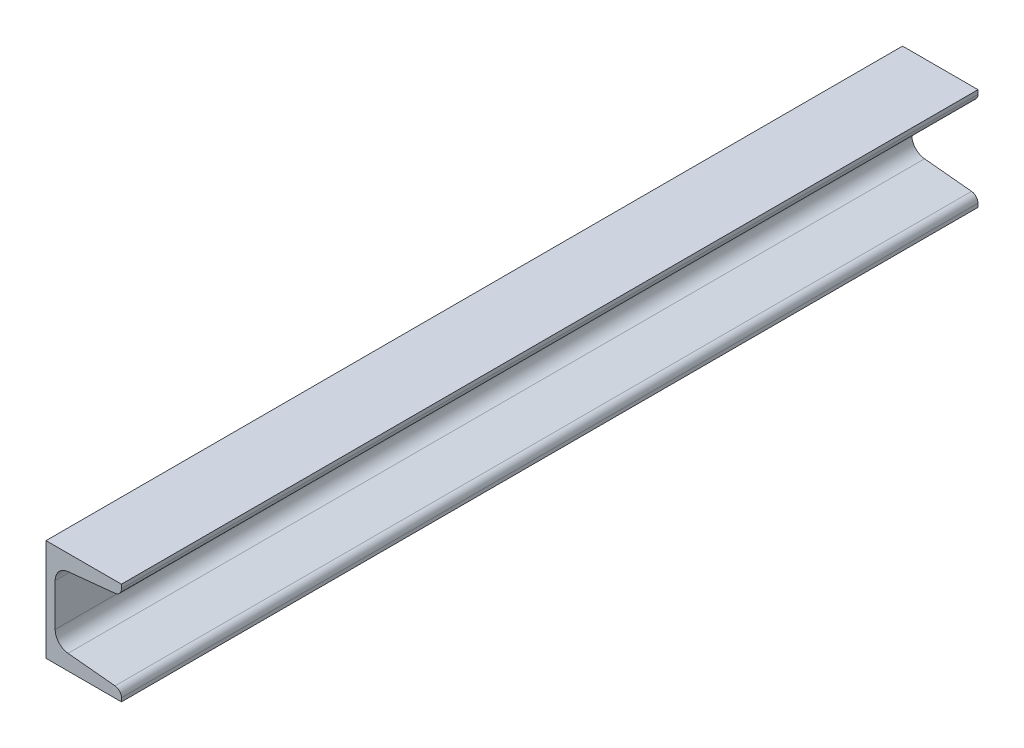
ISO-10303-21;
HEADER;
FILE_DESCRIPTION(('STEP AP214'),'2;1');
FILE_NAME('part.step','',(''),(''),'','','');
FILE_SCHEMA(('AUTOMOTIVE_DESIGN { 1 0 10303 214 1 1 1 1 }'));
ENDSEC;
DATA;
#1=APPLICATION_CONTEXT('core data for automotive mechanical design processes');
#2=APPLICATION_PROTOCOL_DEFINITION('international standard','automotive_design',2000,#1);
#3=PRODUCT_CONTEXT('',#1,'mechanical');
#4=PRODUCT('Part','Part','',(#3));
#5=PRODUCT_RELATED_PRODUCT_CATEGORY('part','',(#4));
#6=PRODUCT_DEFINITION_FORMATION('','',#4);
#7=PRODUCT_DEFINITION_CONTEXT('part definition',#1,'design');
#8=PRODUCT_DEFINITION('design','',#6,#7);
#9=PRODUCT_DEFINITION_SHAPE('','',#8);
#10=(LENGTH_UNIT() NAMED_UNIT(*) SI_UNIT(.MILLI.,.METRE.));
#11=(NAMED_UNIT(*) PLANE_ANGLE_UNIT() SI_UNIT($,.RADIAN.));
#12=(NAMED_UNIT(*) SI_UNIT($,.STERADIAN.) SOLID_ANGLE_UNIT());
#13=UNCERTAINTY_MEASURE_WITH_UNIT(LENGTH_MEASURE(1.E-05),#10,'distance_accuracy_value','');
#14=(GEOMETRIC_REPRESENTATION_CONTEXT(3) GLOBAL_UNCERTAINTY_ASSIGNED_CONTEXT((#13)) GLOBAL_UNIT_ASSIGNED_CONTEXT((#10,
#11,#12)) REPRESENTATION_CONTEXT('',''));
#15=CARTESIAN_POINT('',(0.,0.,0.));
#16=DIRECTION('',(0.,0.,1.));
#17=DIRECTION('',(1.,0.,0.));
#18=AXIS2_PLACEMENT_3D('',#15,#16,#17);
#19=CARTESIAN_POINT('',(0.,0.,420.));
#20=DIRECTION('',(0.,1.,0.));
#21=DIRECTION('',(0.,0.,1.));
#22=AXIS2_PLACEMENT_3D('',#19,#20,#21);
#23=PLANE('',#22);
#24=DIRECTION('',(1.,0.,0.));
#25=VECTOR('',#24,1.);
#26=CARTESIAN_POINT('',(0.,0.,0.));
#27=LINE('',#26,#25);
#28=CARTESIAN_POINT('',(0.,0.,0.));
#29=VERTEX_POINT('',#28);
#30=CARTESIAN_POINT('',(37.,0.,0.));
#31=VERTEX_POINT('',#30);
#32=EDGE_CURVE('E156',#29,#31,#27,.T.);
#33=ORIENTED_EDGE('',*,*,#32,.T.);
#34=DIRECTION('',(0.,0.,-1.));
#35=VECTOR('',#34,1.);
#36=CARTESIAN_POINT('',(37.,0.,420.));
#37=LINE('',#36,#35);
#38=CARTESIAN_POINT('',(37.,0.,420.));
#39=VERTEX_POINT('',#38);
#40=EDGE_CURVE('E11',#39,#31,#37,.T.);
#41=ORIENTED_EDGE('',*,*,#40,.F.);
#42=DIRECTION('',(1.,0.,0.));
#43=VECTOR('',#42,1.);
#44=CARTESIAN_POINT('',(0.,0.,420.));
#45=LINE('',#44,#43);
#46=CARTESIAN_POINT('',(0.,0.,420.));
#47=VERTEX_POINT('',#46);
#48=EDGE_CURVE('E178',#47,#39,#45,.T.);
#49=ORIENTED_EDGE('',*,*,#48,.F.);
#50=DIRECTION('',(0.,0.,-1.));
#51=VECTOR('',#50,1.);
#52=CARTESIAN_POINT('',(0.,0.,420.));
#53=LINE('',#52,#51);
#54=EDGE_CURVE('E152',#47,#29,#53,.T.);
#55=ORIENTED_EDGE('',*,*,#54,.T.);
#56=EDGE_LOOP('',(#33,#41,#49,#55));
#57=FACE_BOUND('',#56,.T.);
#58=ADVANCED_FACE('F36',(#57),#23,.F.);
#59=CARTESIAN_POINT('',(37.,0.,420.));
#60=DIRECTION('',(-1.,0.,0.));
#61=DIRECTION('',(0.,0.,1.));
#62=AXIS2_PLACEMENT_3D('',#59,#60,#61);
#63=PLANE('',#62);
#64=DIRECTION('',(0.,1.,0.));
#65=VECTOR('',#64,1.);
#66=CARTESIAN_POINT('',(37.,0.,0.));
#67=LINE('',#66,#65);
#68=CARTESIAN_POINT('',(37.,1.75754353260767,0.));
#69=VERTEX_POINT('',#68);
#70=EDGE_CURVE('E159',#31,#69,#67,.T.);
#71=ORIENTED_EDGE('',*,*,#70,.T.);
#72=DIRECTION('',(0.,0.,-1.));
#73=VECTOR('',#72,1.);
#74=CARTESIAN_POINT('',(37.,1.75754353260767,420.));
#75=LINE('',#74,#73);
#76=CARTESIAN_POINT('',(37.,1.75754353260767,420.));
#77=VERTEX_POINT('',#76);
#78=EDGE_CURVE('E44',#77,#69,#75,.T.);
#79=ORIENTED_EDGE('',*,*,#78,.F.);
#80=DIRECTION('',(0.,1.,0.));
#81=VECTOR('',#80,1.);
#82=CARTESIAN_POINT('',(37.,0.,420.));
#83=LINE('',#82,#81);
#84=EDGE_CURVE('E107',#39,#77,#83,.T.);
#85=ORIENTED_EDGE('',*,*,#84,.F.);
#86=ORIENTED_EDGE('',*,*,#40,.T.);
#87=EDGE_LOOP('',(#71,#79,#85,#86));
#88=FACE_BOUND('',#87,.T.);
#89=ADVANCED_FACE('F256',(#88),#63,.F.);
#90=CARTESIAN_POINT('',(33.5,1.75754353260769,420.));
#91=DIRECTION('',(0.,0.,-1.));
#92=DIRECTION('',(-1.,0.,0.));
#93=AXIS2_PLACEMENT_3D('',#90,#91,#92);
#94=CYLINDRICAL_SURFACE('',#93,3.5);
#95=CARTESIAN_POINT('',(33.5,1.75754353260769,0.));
#96=DIRECTION('',(0.,0.,1.));
#97=DIRECTION('',(1.,0.,0.));
#98=AXIS2_PLACEMENT_3D('',#95,#96,#97);
#99=CIRCLE('',#98,3.5);
#100=CARTESIAN_POINT('',(33.8482630165735,5.24017369834266,0.));
#101=VERTEX_POINT('',#100);
#102=EDGE_CURVE('E161',#69,#101,#99,.T.);
#103=ORIENTED_EDGE('',*,*,#102,.T.);
#104=DIRECTION('',(0.,0.,-1.));
#105=VECTOR('',#104,1.);
#106=CARTESIAN_POINT('',(33.8482630165735,5.24017369834266,420.));
#107=LINE('',#106,#105);
#108=CARTESIAN_POINT('',(33.8482630165735,5.24017369834266,420.));
#109=VERTEX_POINT('',#108);
#110=EDGE_CURVE('E197',#109,#101,#107,.T.);
#111=ORIENTED_EDGE('',*,*,#110,.F.);
#112=CARTESIAN_POINT('',(33.5,1.75754353260769,420.));
#113=DIRECTION('',(0.,0.,1.));
#114=DIRECTION('',(1.,0.,0.));
#115=AXIS2_PLACEMENT_3D('',#112,#113,#114);
#116=CIRCLE('',#115,3.5);
#117=EDGE_CURVE('E205',#77,#109,#116,.T.);
#118=ORIENTED_EDGE('',*,*,#117,.F.);
#119=ORIENTED_EDGE('',*,*,#78,.T.);
#120=EDGE_LOOP('',(#103,#111,#118,#119));
#121=FACE_BOUND('',#120,.T.);
#122=ADVANCED_FACE('F203',(#121),#94,.T.);
#123=CARTESIAN_POINT('',(10.8034739668531,7.5446526033147,420.));
#124=DIRECTION('',(-0.0995037190209989,-0.995037190209989,0.));
#125=DIRECTION('',(0.995037190209989,-0.0995037190209989,0.));
#126=AXIS2_PLACEMENT_3D('',#123,#124,#125);
#127=PLANE('',#126);
#128=DIRECTION('',(-0.995037190209989,0.0995037190209989,0.));
#129=VECTOR('',#128,1.);
#130=CARTESIAN_POINT('',(10.8034739668531,7.5446526033147,0.));
#131=LINE('',#130,#129);
#132=CARTESIAN_POINT('',(10.8034739668531,7.5446526033147,0.));
#133=VERTEX_POINT('',#132);
#134=EDGE_CURVE('E163',#101,#133,#131,.T.);
#135=ORIENTED_EDGE('',*,*,#134,.T.);
#136=DIRECTION('',(0.,0.,-1.));
#137=VECTOR('',#136,1.);
#138=CARTESIAN_POINT('',(10.8034739668531,7.5446526033147,420.));
#139=LINE('',#138,#137);
#140=CARTESIAN_POINT('',(10.8034739668531,7.5446526033147,420.));
#141=VERTEX_POINT('',#140);
#142=EDGE_CURVE('E194',#141,#133,#139,.T.);
#143=ORIENTED_EDGE('',*,*,#142,.F.);
#144=DIRECTION('',(-0.995037190209989,0.0995037190209989,0.));
#145=VECTOR('',#144,1.);
#146=CARTESIAN_POINT('',(10.8034739668531,7.5446526033147,420.));
#147=LINE('',#146,#145);
#148=EDGE_CURVE('E223',#109,#141,#147,.T.);
#149=ORIENTED_EDGE('',*,*,#148,.F.);
#150=ORIENTED_EDGE('',*,*,#110,.T.);
#151=EDGE_LOOP('',(#135,#143,#149,#150));
#152=FACE_BOUND('',#151,.T.);
#153=ADVANCED_FACE('F214',(#152),#127,.F.);
#154=CARTESIAN_POINT('',(11.5,14.5099129347846,420.));
#155=DIRECTION('',(0.,0.,-1.));
#156=DIRECTION('',(-1.,0.,0.));
#157=AXIS2_PLACEMENT_3D('',#154,#155,#156);
#158=CYLINDRICAL_SURFACE('',#157,7.);
#159=CARTESIAN_POINT('',(11.5,14.5099129347846,0.));
#160=DIRECTION('',(0.,0.,-1.));
#161=DIRECTION('',(1.,0.,0.));
#162=AXIS2_PLACEMENT_3D('',#159,#160,#161);
#163=CIRCLE('',#162,7.);
#164=CARTESIAN_POINT('',(4.5,14.5099129347847,0.));
#165=VERTEX_POINT('',#164);
#166=EDGE_CURVE('E165',#133,#165,#163,.T.);
#167=ORIENTED_EDGE('',*,*,#166,.T.);
#168=DIRECTION('',(0.,0.,-1.));
#169=VECTOR('',#168,1.);
#170=CARTESIAN_POINT('',(4.5,14.5099129347847,420.));
#171=LINE('',#170,#169);
#172=CARTESIAN_POINT('',(4.5,14.5099129347847,420.));
#173=VERTEX_POINT('',#172);
#174=EDGE_CURVE('E191',#173,#165,#171,.T.);
#175=ORIENTED_EDGE('',*,*,#174,.F.);
#176=CARTESIAN_POINT('',(11.5,14.5099129347846,420.));
#177=DIRECTION('',(0.,0.,-1.));
#178=DIRECTION('',(1.,0.,0.));
#179=AXIS2_PLACEMENT_3D('',#176,#177,#178);
#180=CIRCLE('',#179,7.);
#181=EDGE_CURVE('E220',#141,#173,#180,.T.);
#182=ORIENTED_EDGE('',*,*,#181,.F.);
#183=ORIENTED_EDGE('',*,*,#142,.T.);
#184=EDGE_LOOP('',(#167,#175,#182,#183));
#185=FACE_BOUND('',#184,.T.);
#186=ADVANCED_FACE('F218',(#185),#158,.F.);
#187=CARTESIAN_POINT('',(4.5,14.5099129347847,420.));
#188=DIRECTION('',(-1.,0.,0.));
#189=DIRECTION('',(0.,-1.,0.));
#190=AXIS2_PLACEMENT_3D('',#187,#188,#189);
#191=PLANE('',#190);
#192=DIRECTION('',(0.,1.,0.));
#193=VECTOR('',#192,1.);
#194=CARTESIAN_POINT('',(4.5,14.5099129347847,0.));
#195=LINE('',#194,#193);
#196=CARTESIAN_POINT('',(4.5,35.2876429963102,0.));
#197=VERTEX_POINT('',#196);
#198=EDGE_CURVE('E167',#165,#197,#195,.T.);
#199=ORIENTED_EDGE('',*,*,#198,.T.);
#200=DIRECTION('',(0.,0.,-1.));
#201=VECTOR('',#200,1.);
#202=CARTESIAN_POINT('',(4.5,35.2876429963102,420.));
#203=LINE('',#202,#201);
#204=CARTESIAN_POINT('',(4.5,35.2876429963102,420.));
#205=VERTEX_POINT('',#204);
#206=EDGE_CURVE('E188',#205,#197,#203,.T.);
#207=ORIENTED_EDGE('',*,*,#206,.F.);
#208=DIRECTION('',(0.,1.,0.));
#209=VECTOR('',#208,1.);
#210=CARTESIAN_POINT('',(4.5,14.5099129347847,420.));
#211=LINE('',#210,#209);
#212=EDGE_CURVE('E222',#173,#205,#211,.T.);
#213=ORIENTED_EDGE('',*,*,#212,.F.);
#214=ORIENTED_EDGE('',*,*,#174,.T.);
#215=EDGE_LOOP('',(#199,#207,#213,#214));
#216=FACE_BOUND('',#215,.T.);
#217=ADVANCED_FACE('F269',(#216),#191,.F.);
#218=CARTESIAN_POINT('',(11.5,35.2876429963103,420.));
#219=DIRECTION('',(0.,0.,-1.));
#220=DIRECTION('',(-1.,0.,0.));
#221=AXIS2_PLACEMENT_3D('',#218,#219,#220);
#222=CYLINDRICAL_SURFACE('',#221,7.);
#223=CARTESIAN_POINT('',(11.5,35.2876429963103,0.));
#224=DIRECTION('',(0.,0.,-1.));
#225=DIRECTION('',(1.,0.,0.));
#226=AXIS2_PLACEMENT_3D('',#223,#224,#225);
#227=CIRCLE('',#226,7.);
#228=CARTESIAN_POINT('',(10.803473966853,42.2529033277802,0.));
#229=VERTEX_POINT('',#228);
#230=EDGE_CURVE('E169',#197,#229,#227,.T.);
#231=ORIENTED_EDGE('',*,*,#230,.T.);
#232=DIRECTION('',(0.,0.,-1.));
#233=VECTOR('',#232,1.);
#234=CARTESIAN_POINT('',(10.803473966853,42.2529033277802,420.));
#235=LINE('',#234,#233);
#236=CARTESIAN_POINT('',(10.803473966853,42.2529033277802,420.));
#237=VERTEX_POINT('',#236);
#238=EDGE_CURVE('E185',#237,#229,#235,.T.);
#239=ORIENTED_EDGE('',*,*,#238,.F.);
#240=CARTESIAN_POINT('',(11.5,35.2876429963103,420.));
#241=DIRECTION('',(0.,0.,-1.));
#242=DIRECTION('',(1.,0.,0.));
#243=AXIS2_PLACEMENT_3D('',#240,#241,#242);
#244=CIRCLE('',#243,7.);
#245=EDGE_CURVE('E225',#205,#237,#244,.T.);
#246=ORIENTED_EDGE('',*,*,#245,.F.);
#247=ORIENTED_EDGE('',*,*,#206,.T.);
#248=EDGE_LOOP('',(#231,#239,#246,#247));
#249=FACE_BOUND('',#248,.T.);
#250=ADVANCED_FACE('F272',(#249),#222,.F.);
#251=CARTESIAN_POINT('',(10.803473966853,42.2529033277802,420.));
#252=DIRECTION('',(-0.0995037190209989,0.995037190209989,0.));
#253=DIRECTION('',(-0.995037190209989,-0.0995037190209989,0.));
#254=AXIS2_PLACEMENT_3D('',#251,#252,#253);
#255=PLANE('',#254);
#256=DIRECTION('',(0.995037190209989,0.0995037190209989,0.));
#257=VECTOR('',#256,1.);
#258=CARTESIAN_POINT('',(10.803473966853,42.2529033277802,0.));
#259=LINE('',#258,#257);
#260=CARTESIAN_POINT('',(33.8482630165735,44.5573822327522,0.));
#261=VERTEX_POINT('',#260);
#262=EDGE_CURVE('E171',#229,#261,#259,.T.);
#263=ORIENTED_EDGE('',*,*,#262,.T.);
#264=DIRECTION('',(0.,0.,-1.));
#265=VECTOR('',#264,1.);
#266=CARTESIAN_POINT('',(33.8482630165735,44.5573822327522,420.));
#267=LINE('',#266,#265);
#268=CARTESIAN_POINT('',(33.8482630165735,44.5573822327522,420.));
#269=VERTEX_POINT('',#268);
#270=EDGE_CURVE('E182',#269,#261,#267,.T.);
#271=ORIENTED_EDGE('',*,*,#270,.F.);
#272=DIRECTION('',(0.995037190209989,0.0995037190209989,0.));
#273=VECTOR('',#272,1.);
#274=CARTESIAN_POINT('',(10.803473966853,42.2529033277802,420.));
#275=LINE('',#274,#273);
#276=EDGE_CURVE('E231',#237,#269,#275,.T.);
#277=ORIENTED_EDGE('',*,*,#276,.F.);
#278=ORIENTED_EDGE('',*,*,#238,.T.);
#279=EDGE_LOOP('',(#263,#271,#277,#278));
#280=FACE_BOUND('',#279,.T.);
#281=ADVANCED_FACE('F237',(#280),#255,.F.);
#282=CARTESIAN_POINT('',(33.5,48.0400123984872,420.));
#283=DIRECTION('',(0.,0.,-1.));
#284=DIRECTION('',(-1.,0.,0.));
#285=AXIS2_PLACEMENT_3D('',#282,#283,#284);
#286=CYLINDRICAL_SURFACE('',#285,3.50000000000001);
#287=CARTESIAN_POINT('',(33.5,48.0400123984872,0.));
#288=DIRECTION('',(0.,0.,1.));
#289=DIRECTION('',(1.,0.,0.));
#290=AXIS2_PLACEMENT_3D('',#287,#288,#289);
#291=CIRCLE('',#290,3.50000000000001);
#292=CARTESIAN_POINT('',(37.,48.0400123984872,0.));
#293=VERTEX_POINT('',#292);
#294=EDGE_CURVE('E173',#261,#293,#291,.T.);
#295=ORIENTED_EDGE('',*,*,#294,.T.);
#296=DIRECTION('',(0.,0.,-1.));
#297=VECTOR('',#296,1.);
#298=CARTESIAN_POINT('',(37.,48.0400123984872,420.));
#299=LINE('',#298,#297);
#300=CARTESIAN_POINT('',(37.,48.0400123984872,420.));
#301=VERTEX_POINT('',#300);
#302=EDGE_CURVE('E147',#301,#293,#299,.T.);
#303=ORIENTED_EDGE('',*,*,#302,.F.);
#304=CARTESIAN_POINT('',(33.5,48.0400123984872,420.));
#305=DIRECTION('',(0.,0.,1.));
#306=DIRECTION('',(1.,0.,0.));
#307=AXIS2_PLACEMENT_3D('',#304,#305,#306);
#308=CIRCLE('',#307,3.50000000000001);
#309=EDGE_CURVE('E138',#269,#301,#308,.T.);
#310=ORIENTED_EDGE('',*,*,#309,.F.);
#311=ORIENTED_EDGE('',*,*,#270,.T.);
#312=EDGE_LOOP('',(#295,#303,#310,#311));
#313=FACE_BOUND('',#312,.T.);
#314=ADVANCED_FACE('F241',(#313),#286,.T.);
#315=CARTESIAN_POINT('',(37.,48.0400123984872,420.));
#316=DIRECTION('',(-1.,0.,0.));
#317=DIRECTION('',(0.,0.,1.));
#318=AXIS2_PLACEMENT_3D('',#315,#316,#317);
#319=PLANE('',#318);
#320=DIRECTION('',(0.,1.,0.));
#321=VECTOR('',#320,1.);
#322=CARTESIAN_POINT('',(37.,48.0400123984872,0.));
#323=LINE('',#322,#321);
#324=CARTESIAN_POINT('',(37.,50.,0.));
#325=VERTEX_POINT('',#324);
#326=EDGE_CURVE('E146',#293,#325,#323,.T.);
#327=ORIENTED_EDGE('',*,*,#326,.T.);
#328=DIRECTION('',(0.,0.,-1.));
#329=VECTOR('',#328,1.);
#330=CARTESIAN_POINT('',(37.,50.,420.));
#331=LINE('',#330,#329);
#332=CARTESIAN_POINT('',(37.,50.,420.));
#333=VERTEX_POINT('',#332);
#334=EDGE_CURVE('E143',#333,#325,#331,.T.);
#335=ORIENTED_EDGE('',*,*,#334,.F.);
#336=DIRECTION('',(0.,1.,0.));
#337=VECTOR('',#336,1.);
#338=CARTESIAN_POINT('',(37.,48.0400123984872,420.));
#339=LINE('',#338,#337);
#340=EDGE_CURVE('E132',#301,#333,#339,.T.);
#341=ORIENTED_EDGE('',*,*,#340,.F.);
#342=ORIENTED_EDGE('',*,*,#302,.T.);
#343=EDGE_LOOP('',(#327,#335,#341,#342));
#344=FACE_BOUND('',#343,.T.);
#345=ADVANCED_FACE('F144',(#344),#319,.F.);
#346=CARTESIAN_POINT('',(-1.71512449944288E-13,50.,420.));
#347=DIRECTION('',(0.,-1.,0.));
#348=DIRECTION('',(0.,0.,-1.));
#349=AXIS2_PLACEMENT_3D('',#346,#347,#348);
#350=PLANE('',#349);
#351=DIRECTION('',(-1.,0.,0.));
#352=VECTOR('',#351,1.);
#353=CARTESIAN_POINT('',(-1.71512449944288E-13,50.,0.));
#354=LINE('',#353,#352);
#355=CARTESIAN_POINT('',(-1.71512449944288E-13,50.,0.));
#356=VERTEX_POINT('',#355);
#357=EDGE_CURVE('E93',#325,#356,#354,.T.);
#358=ORIENTED_EDGE('',*,*,#357,.T.);
#359=DIRECTION('',(0.,0.,-1.));
#360=VECTOR('',#359,1.);
#361=CARTESIAN_POINT('',(-1.71512449944288E-13,50.,420.));
#362=LINE('',#361,#360);
#363=CARTESIAN_POINT('',(-1.71512449944288E-13,50.,420.));
#364=VERTEX_POINT('',#363);
#365=EDGE_CURVE('E148',#364,#356,#362,.T.);
#366=ORIENTED_EDGE('',*,*,#365,.F.);
#367=DIRECTION('',(-1.,0.,0.));
#368=VECTOR('',#367,1.);
#369=CARTESIAN_POINT('',(-1.71512449944288E-13,50.,420.));
#370=LINE('',#369,#368);
#371=EDGE_CURVE('E136',#333,#364,#370,.T.);
#372=ORIENTED_EDGE('',*,*,#371,.F.);
#373=ORIENTED_EDGE('',*,*,#334,.T.);
#374=EDGE_LOOP('',(#358,#366,#372,#373));
#375=FACE_BOUND('',#374,.T.);
#376=ADVANCED_FACE('F150',(#375),#350,.F.);
#377=CARTESIAN_POINT('',(0.,0.,420.));
#378=DIRECTION('',(1.,0.,0.));
#379=DIRECTION('',(0.,1.,0.));
#380=AXIS2_PLACEMENT_3D('',#377,#378,#379);
#381=PLANE('',#380);
#382=DIRECTION('',(0.,-1.,0.));
#383=VECTOR('',#382,1.);
#384=CARTESIAN_POINT('',(0.,0.,0.));
#385=LINE('',#384,#383);
#386=EDGE_CURVE('E99',#356,#29,#385,.T.);
#387=ORIENTED_EDGE('',*,*,#386,.T.);
#388=ORIENTED_EDGE('',*,*,#54,.F.);
#389=DIRECTION('',(0.,-1.,0.));
#390=VECTOR('',#389,1.);
#391=CARTESIAN_POINT('',(0.,0.,420.));
#392=LINE('',#391,#390);
#393=EDGE_CURVE('E52',#364,#47,#392,.T.);
#394=ORIENTED_EDGE('',*,*,#393,.F.);
#395=ORIENTED_EDGE('',*,*,#365,.T.);
#396=EDGE_LOOP('',(#387,#388,#394,#395));
#397=FACE_BOUND('',#396,.T.);
#398=ADVANCED_FACE('F245',(#397),#381,.F.);
#399=CARTESIAN_POINT('',(33.5,1.75754353260769,420.));
#400=DIRECTION('',(0.,0.,1.));
#401=DIRECTION('',(1.,0.,0.));
#402=AXIS2_PLACEMENT_3D('',#399,#400,#401);
#403=PLANE('',#402);
#404=ORIENTED_EDGE('',*,*,#48,.T.);
#405=ORIENTED_EDGE('',*,*,#84,.T.);
#406=ORIENTED_EDGE('',*,*,#117,.T.);
#407=ORIENTED_EDGE('',*,*,#148,.T.);
#408=ORIENTED_EDGE('',*,*,#181,.T.);
#409=ORIENTED_EDGE('',*,*,#212,.T.);
#410=ORIENTED_EDGE('',*,*,#245,.T.);
#411=ORIENTED_EDGE('',*,*,#276,.T.);
#412=ORIENTED_EDGE('',*,*,#309,.T.);
#413=ORIENTED_EDGE('',*,*,#340,.T.);
#414=ORIENTED_EDGE('',*,*,#371,.T.);
#415=ORIENTED_EDGE('',*,*,#393,.T.);
#416=EDGE_LOOP('',(#404,#405,#406,#407,#408,#409,#410,#411,#412,#413,#414,#415));
#417=FACE_BOUND('',#416,.T.);
#418=ADVANCED_FACE('F134',(#417),#403,.T.);
#419=CARTESIAN_POINT('',(33.5,1.75754353260769,0.));
#420=DIRECTION('',(0.,0.,1.));
#421=DIRECTION('',(1.,0.,0.));
#422=AXIS2_PLACEMENT_3D('',#419,#420,#421);
#423=PLANE('',#422);
#424=ORIENTED_EDGE('',*,*,#32,.F.);
#425=ORIENTED_EDGE('',*,*,#386,.F.);
#426=ORIENTED_EDGE('',*,*,#357,.F.);
#427=ORIENTED_EDGE('',*,*,#326,.F.);
#428=ORIENTED_EDGE('',*,*,#294,.F.);
#429=ORIENTED_EDGE('',*,*,#262,.F.);
#430=ORIENTED_EDGE('',*,*,#230,.F.);
#431=ORIENTED_EDGE('',*,*,#198,.F.);
#432=ORIENTED_EDGE('',*,*,#166,.F.);
#433=ORIENTED_EDGE('',*,*,#134,.F.);
#434=ORIENTED_EDGE('',*,*,#102,.F.);
#435=ORIENTED_EDGE('',*,*,#70,.F.);
#436=EDGE_LOOP('',(#424,#425,#426,#427,#428,#429,#430,#431,#432,#433,#434,#435));
#437=FACE_BOUND('',#436,.T.);
#438=ADVANCED_FACE('F209',(#437),#423,.F.);
#439=CLOSED_SHELL('',(#58,#89,#122,#153,#186,#217,#250,#281,#314,#345,#376,#398,#418,#438));
#440=MANIFOLD_SOLID_BREP('B2',#439);
#441=ADVANCED_BREP_SHAPE_REPRESENTATION('',(#18,#440),#14);
#442=SHAPE_DEFINITION_REPRESENTATION(#9,#441);
ENDSEC;
END-ISO-10303-21;
